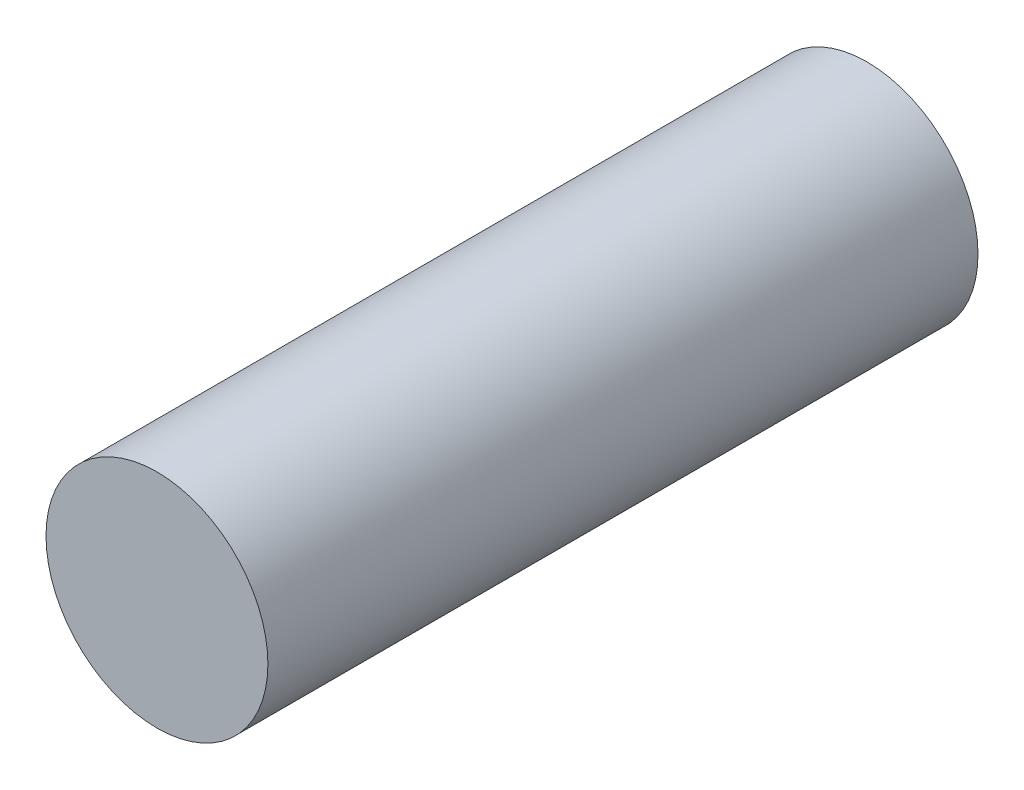
ISO-10303-21;
HEADER;
FILE_DESCRIPTION(('STEP AP214'),'2;1');
FILE_NAME('part.step','',(''),(''),'','','');
FILE_SCHEMA(('AUTOMOTIVE_DESIGN { 1 0 10303 214 1 1 1 1 }'));
ENDSEC;
DATA;
#1=APPLICATION_CONTEXT('core data for automotive mechanical design processes');
#2=APPLICATION_PROTOCOL_DEFINITION('international standard','automotive_design',2000,#1);
#3=PRODUCT_CONTEXT('',#1,'mechanical');
#4=PRODUCT('Part','Part','',(#3));
#5=PRODUCT_RELATED_PRODUCT_CATEGORY('part','',(#4));
#6=PRODUCT_DEFINITION_FORMATION('','',#4);
#7=PRODUCT_DEFINITION_CONTEXT('part definition',#1,'design');
#8=PRODUCT_DEFINITION('design','',#6,#7);
#9=PRODUCT_DEFINITION_SHAPE('','',#8);
#10=(LENGTH_UNIT() NAMED_UNIT(*) SI_UNIT(.MILLI.,.METRE.));
#11=(NAMED_UNIT(*) PLANE_ANGLE_UNIT() SI_UNIT($,.RADIAN.));
#12=(NAMED_UNIT(*) SI_UNIT($,.STERADIAN.) SOLID_ANGLE_UNIT());
#13=UNCERTAINTY_MEASURE_WITH_UNIT(LENGTH_MEASURE(1.E-05),#10,'distance_accuracy_value','');
#14=(GEOMETRIC_REPRESENTATION_CONTEXT(3) GLOBAL_UNCERTAINTY_ASSIGNED_CONTEXT((#13)) GLOBAL_UNIT_ASSIGNED_CONTEXT((#10,
#11,#12)) REPRESENTATION_CONTEXT('',''));
#15=CARTESIAN_POINT('',(0.,0.,0.));
#16=DIRECTION('',(0.,0.,1.));
#17=DIRECTION('',(1.,0.,0.));
#18=AXIS2_PLACEMENT_3D('',#15,#16,#17);
#19=CARTESIAN_POINT('',(0.,0.,80.));
#20=DIRECTION('',(0.,0.,-1.));
#21=DIRECTION('',(-1.,0.,0.));
#22=AXIS2_PLACEMENT_3D('',#19,#20,#21);
#23=CYLINDRICAL_SURFACE('',#22,12.5);
#24=CARTESIAN_POINT('',(0.,0.,80.));
#25=DIRECTION('',(0.,0.,1.));
#26=DIRECTION('',(1.,0.,0.));
#27=AXIS2_PLACEMENT_3D('',#24,#25,#26);
#28=CIRCLE('',#27,12.5);
#29=CARTESIAN_POINT('',(12.5,0.,80.));
#30=VERTEX_POINT('',#29);
#31=EDGE_CURVE('E10',#30,#30,#28,.T.);
#32=ORIENTED_EDGE('',*,*,#31,.F.);
#33=EDGE_LOOP('',(#32));
#34=FACE_BOUND('',#33,.T.);
#35=CARTESIAN_POINT('',(0.,0.,0.));
#36=DIRECTION('',(0.,0.,1.));
#37=DIRECTION('',(1.,0.,0.));
#38=AXIS2_PLACEMENT_3D('',#35,#36,#37);
#39=CIRCLE('',#38,12.5);
#40=CARTESIAN_POINT('',(12.5,0.,0.));
#41=VERTEX_POINT('',#40);
#42=EDGE_CURVE('E40',#41,#41,#39,.T.);
#43=ORIENTED_EDGE('',*,*,#42,.T.);
#44=EDGE_LOOP('',(#43));
#45=FACE_BOUND('',#44,.T.);
#46=ADVANCED_FACE('F37',(#34,#45),#23,.T.);
#47=CARTESIAN_POINT('',(0.,0.,80.));
#48=DIRECTION('',(0.,0.,1.));
#49=DIRECTION('',(1.,0.,0.));
#50=AXIS2_PLACEMENT_3D('',#47,#48,#49);
#51=PLANE('',#50);
#52=ORIENTED_EDGE('',*,*,#31,.T.);
#53=EDGE_LOOP('',(#52));
#54=FACE_BOUND('',#53,.T.);
#55=ADVANCED_FACE('F54',(#54),#51,.T.);
#56=CARTESIAN_POINT('',(0.,0.,0.));
#57=DIRECTION('',(0.,0.,1.));
#58=DIRECTION('',(1.,0.,0.));
#59=AXIS2_PLACEMENT_3D('',#56,#57,#58);
#60=PLANE('',#59);
#61=ORIENTED_EDGE('',*,*,#42,.F.);
#62=EDGE_LOOP('',(#61));
#63=FACE_BOUND('',#62,.T.);
#64=ADVANCED_FACE('F52',(#63),#60,.F.);
#65=CLOSED_SHELL('',(#46,#55,#64));
#66=MANIFOLD_SOLID_BREP('B2',#65);
#67=ADVANCED_BREP_SHAPE_REPRESENTATION('',(#18,#66),#14);
#68=SHAPE_DEFINITION_REPRESENTATION(#9,#67);
ENDSEC;
END-ISO-10303-21;
